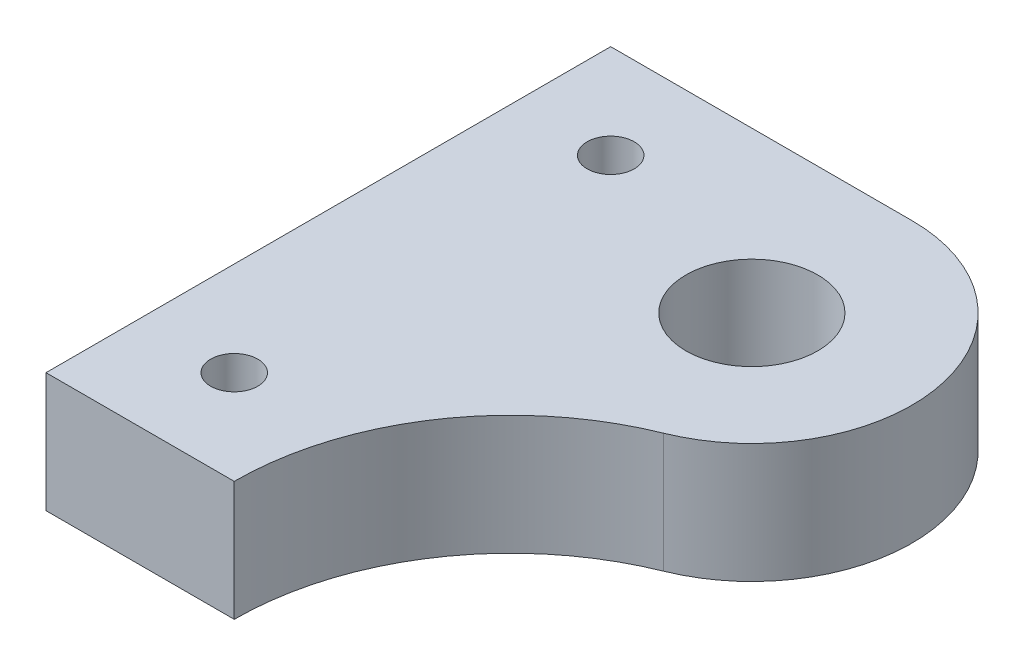
ISO-10303-21;
HEADER;
FILE_DESCRIPTION(('STEP AP214'),'2;1');
FILE_NAME('part.step','',(''),(''),'','','');
FILE_SCHEMA(('AUTOMOTIVE_DESIGN { 1 0 10303 214 1 1 1 1 }'));
ENDSEC;
DATA;
#1=APPLICATION_CONTEXT('core data for automotive mechanical design processes');
#2=APPLICATION_PROTOCOL_DEFINITION('international standard','automotive_design',2000,#1);
#3=PRODUCT_CONTEXT('',#1,'mechanical');
#4=PRODUCT('Part','Part','',(#3));
#5=PRODUCT_RELATED_PRODUCT_CATEGORY('part','',(#4));
#6=PRODUCT_DEFINITION_FORMATION('','',#4);
#7=PRODUCT_DEFINITION_CONTEXT('part definition',#1,'design');
#8=PRODUCT_DEFINITION('design','',#6,#7);
#9=PRODUCT_DEFINITION_SHAPE('','',#8);
#10=(LENGTH_UNIT() NAMED_UNIT(*) SI_UNIT(.MILLI.,.METRE.));
#11=(NAMED_UNIT(*) PLANE_ANGLE_UNIT() SI_UNIT($,.RADIAN.));
#12=(NAMED_UNIT(*) SI_UNIT($,.STERADIAN.) SOLID_ANGLE_UNIT());
#13=UNCERTAINTY_MEASURE_WITH_UNIT(LENGTH_MEASURE(1.E-05),#10,'distance_accuracy_value','');
#14=(GEOMETRIC_REPRESENTATION_CONTEXT(3) GLOBAL_UNCERTAINTY_ASSIGNED_CONTEXT((#13)) GLOBAL_UNIT_ASSIGNED_CONTEXT((#10,
#11,#12)) REPRESENTATION_CONTEXT('',''));
#15=CARTESIAN_POINT('',(0.,0.,0.));
#16=DIRECTION('',(0.,0.,1.));
#17=DIRECTION('',(1.,0.,0.));
#18=AXIS2_PLACEMENT_3D('',#15,#16,#17);
#19=CARTESIAN_POINT('',(49.3793103448276,6.35,0.));
#20=DIRECTION('',(0.,-1.,0.));
#21=DIRECTION('',(0.,0.,-1.));
#22=AXIS2_PLACEMENT_3D('',#19,#20,#21);
#23=PLANE('',#22);
#24=CARTESIAN_POINT('',(49.3793103448276,6.35,0.));
#25=DIRECTION('',(0.,-1.,0.));
#26=DIRECTION('',(0.,0.,-1.));
#27=AXIS2_PLACEMENT_3D('',#24,#25,#26);
#28=CIRCLE('',#27,29.3793103448276);
#29=CARTESIAN_POINT('',(20.,6.35,0.));
#30=VERTEX_POINT('',#29);
#31=CARTESIAN_POINT('',(38.3702602230483,6.35,-27.2386617100372));
#32=VERTEX_POINT('',#31);
#33=EDGE_CURVE('E117',#30,#32,#28,.T.);
#34=ORIENTED_EDGE('',*,*,#33,.T.);
#35=CARTESIAN_POINT('',(32.,6.35,-43.));
#36=DIRECTION('',(0.,1.,0.));
#37=DIRECTION('',(0.,0.,1.));
#38=AXIS2_PLACEMENT_3D('',#35,#36,#37);
#39=CIRCLE('',#38,17.);
#40=CARTESIAN_POINT('',(32.,6.35,-60.));
#41=VERTEX_POINT('',#40);
#42=EDGE_CURVE('E84',#32,#41,#39,.T.);
#43=ORIENTED_EDGE('',*,*,#42,.T.);
#44=DIRECTION('',(-1.,0.,0.));
#45=VECTOR('',#44,1.);
#46=CARTESIAN_POINT('',(32.,6.35,-60.));
#47=LINE('',#46,#45);
#48=CARTESIAN_POINT('',(0.,6.35,-60.));
#49=VERTEX_POINT('',#48);
#50=EDGE_CURVE('E88',#41,#49,#47,.T.);
#51=ORIENTED_EDGE('',*,*,#50,.T.);
#52=DIRECTION('',(0.,0.,1.));
#53=VECTOR('',#52,1.);
#54=CARTESIAN_POINT('',(0.,6.35,0.));
#55=LINE('',#54,#53);
#56=CARTESIAN_POINT('',(0.,6.35,0.));
#57=VERTEX_POINT('',#56);
#58=EDGE_CURVE('E92',#49,#57,#55,.T.);
#59=ORIENTED_EDGE('',*,*,#58,.T.);
#60=DIRECTION('',(1.,0.,0.));
#61=VECTOR('',#60,1.);
#62=CARTESIAN_POINT('',(20.,6.35,0.));
#63=LINE('',#62,#61);
#64=EDGE_CURVE('E50',#57,#30,#63,.T.);
#65=ORIENTED_EDGE('',*,*,#64,.T.);
#66=EDGE_LOOP('',(#34,#43,#51,#59,#65));
#67=FACE_BOUND('',#66,.T.);
#68=CARTESIAN_POINT('',(32.,6.35,-43.));
#69=DIRECTION('',(0.,1.,0.));
#70=DIRECTION('',(0.,0.,1.));
#71=AXIS2_PLACEMENT_3D('',#68,#69,#70);
#72=CIRCLE('',#71,7.00000000000002);
#73=CARTESIAN_POINT('',(32.,6.35,-36.));
#74=VERTEX_POINT('',#73);
#75=EDGE_CURVE('E112',#74,#74,#72,.T.);
#76=ORIENTED_EDGE('',*,*,#75,.F.);
#77=EDGE_LOOP('',(#76));
#78=FACE_BOUND('',#77,.T.);
#79=CARTESIAN_POINT('',(10.,6.35,-10.));
#80=DIRECTION('',(0.,1.,0.));
#81=DIRECTION('',(0.,0.,1.));
#82=AXIS2_PLACEMENT_3D('',#79,#80,#81);
#83=CIRCLE('',#82,2.5);
#84=CARTESIAN_POINT('',(10.,6.35,-7.5));
#85=VERTEX_POINT('',#84);
#86=EDGE_CURVE('E166',#85,#85,#83,.T.);
#87=ORIENTED_EDGE('',*,*,#86,.F.);
#88=EDGE_LOOP('',(#87));
#89=FACE_BOUND('',#88,.T.);
#90=CARTESIAN_POINT('',(10.,6.35,-50.));
#91=DIRECTION('',(0.,1.,0.));
#92=DIRECTION('',(0.,0.,1.));
#93=AXIS2_PLACEMENT_3D('',#90,#91,#92);
#94=CIRCLE('',#93,2.5);
#95=CARTESIAN_POINT('',(10.,6.35,-47.5));
#96=VERTEX_POINT('',#95);
#97=EDGE_CURVE('E157',#96,#96,#94,.T.);
#98=ORIENTED_EDGE('',*,*,#97,.F.);
#99=EDGE_LOOP('',(#98));
#100=FACE_BOUND('',#99,.T.);
#101=ADVANCED_FACE('F33',(#67,#78,#89,#100),#23,.F.);
#102=CARTESIAN_POINT('',(49.3793103448276,-6.35,0.));
#103=DIRECTION('',(0.,-1.,0.));
#104=DIRECTION('',(0.,0.,-1.));
#105=AXIS2_PLACEMENT_3D('',#102,#103,#104);
#106=PLANE('',#105);
#107=CARTESIAN_POINT('',(10.,-6.35,-10.));
#108=DIRECTION('',(0.,1.,0.));
#109=DIRECTION('',(0.,0.,1.));
#110=AXIS2_PLACEMENT_3D('',#107,#108,#109);
#111=CIRCLE('',#110,2.5);
#112=CARTESIAN_POINT('',(10.,-6.35,-7.5));
#113=VERTEX_POINT('',#112);
#114=EDGE_CURVE('E163',#113,#113,#111,.T.);
#115=ORIENTED_EDGE('',*,*,#114,.T.);
#116=EDGE_LOOP('',(#115));
#117=FACE_BOUND('',#116,.T.);
#118=CARTESIAN_POINT('',(49.3793103448276,-6.35,0.));
#119=DIRECTION('',(0.,-1.,0.));
#120=DIRECTION('',(0.,0.,-1.));
#121=AXIS2_PLACEMENT_3D('',#118,#119,#120);
#122=CIRCLE('',#121,29.3793103448276);
#123=CARTESIAN_POINT('',(20.,-6.35,0.));
#124=VERTEX_POINT('',#123);
#125=CARTESIAN_POINT('',(38.3702602230483,-6.35,-27.2386617100372));
#126=VERTEX_POINT('',#125);
#127=EDGE_CURVE('E108',#124,#126,#122,.T.);
#128=ORIENTED_EDGE('',*,*,#127,.F.);
#129=DIRECTION('',(1.,0.,0.));
#130=VECTOR('',#129,1.);
#131=CARTESIAN_POINT('',(20.,-6.35,0.));
#132=LINE('',#131,#130);
#133=CARTESIAN_POINT('',(0.,-6.35,0.));
#134=VERTEX_POINT('',#133);
#135=EDGE_CURVE('E76',#134,#124,#132,.T.);
#136=ORIENTED_EDGE('',*,*,#135,.F.);
#137=DIRECTION('',(0.,0.,1.));
#138=VECTOR('',#137,1.);
#139=CARTESIAN_POINT('',(0.,-6.35,0.));
#140=LINE('',#139,#138);
#141=CARTESIAN_POINT('',(0.,-6.35,-60.));
#142=VERTEX_POINT('',#141);
#143=EDGE_CURVE('E70',#142,#134,#140,.T.);
#144=ORIENTED_EDGE('',*,*,#143,.F.);
#145=DIRECTION('',(-1.,0.,0.));
#146=VECTOR('',#145,1.);
#147=CARTESIAN_POINT('',(32.,-6.35,-60.));
#148=LINE('',#147,#146);
#149=CARTESIAN_POINT('',(32.,-6.35,-60.));
#150=VERTEX_POINT('',#149);
#151=EDGE_CURVE('E99',#150,#142,#148,.T.);
#152=ORIENTED_EDGE('',*,*,#151,.F.);
#153=CARTESIAN_POINT('',(32.,-6.35,-43.));
#154=DIRECTION('',(0.,1.,0.));
#155=DIRECTION('',(0.,0.,1.));
#156=AXIS2_PLACEMENT_3D('',#153,#154,#155);
#157=CIRCLE('',#156,17.);
#158=EDGE_CURVE('E111',#126,#150,#157,.T.);
#159=ORIENTED_EDGE('',*,*,#158,.F.);
#160=EDGE_LOOP('',(#128,#136,#144,#152,#159));
#161=FACE_BOUND('',#160,.T.);
#162=CARTESIAN_POINT('',(32.,-6.35,-43.));
#163=DIRECTION('',(0.,1.,0.));
#164=DIRECTION('',(0.,0.,1.));
#165=AXIS2_PLACEMENT_3D('',#162,#163,#164);
#166=CIRCLE('',#165,7.00000000000002);
#167=CARTESIAN_POINT('',(32.,-6.35,-36.));
#168=VERTEX_POINT('',#167);
#169=EDGE_CURVE('E169',#168,#168,#166,.T.);
#170=ORIENTED_EDGE('',*,*,#169,.T.);
#171=EDGE_LOOP('',(#170));
#172=FACE_BOUND('',#171,.T.);
#173=CARTESIAN_POINT('',(10.,-6.35,-50.));
#174=DIRECTION('',(0.,1.,0.));
#175=DIRECTION('',(0.,0.,1.));
#176=AXIS2_PLACEMENT_3D('',#173,#174,#175);
#177=CIRCLE('',#176,2.5);
#178=CARTESIAN_POINT('',(10.,-6.35,-47.5));
#179=VERTEX_POINT('',#178);
#180=EDGE_CURVE('E160',#179,#179,#177,.T.);
#181=ORIENTED_EDGE('',*,*,#180,.T.);
#182=EDGE_LOOP('',(#181));
#183=FACE_BOUND('',#182,.T.);
#184=ADVANCED_FACE('F121',(#117,#161,#172,#183),#106,.T.);
#185=CARTESIAN_POINT('',(49.3793103448276,6.35,0.));
#186=DIRECTION('',(0.,-1.,0.));
#187=DIRECTION('',(0.,0.,-1.));
#188=AXIS2_PLACEMENT_3D('',#185,#186,#187);
#189=CYLINDRICAL_SURFACE('',#188,29.3793103448276);
#190=ORIENTED_EDGE('',*,*,#127,.T.);
#191=DIRECTION('',(0.,-1.,0.));
#192=VECTOR('',#191,1.);
#193=CARTESIAN_POINT('',(38.3702602230483,6.35,-27.2386617100372));
#194=LINE('',#193,#192);
#195=EDGE_CURVE('E11',#32,#126,#194,.T.);
#196=ORIENTED_EDGE('',*,*,#195,.F.);
#197=ORIENTED_EDGE('',*,*,#33,.F.);
#198=DIRECTION('',(0.,-1.,0.));
#199=VECTOR('',#198,1.);
#200=CARTESIAN_POINT('',(20.,6.35,0.));
#201=LINE('',#200,#199);
#202=EDGE_CURVE('E104',#30,#124,#201,.T.);
#203=ORIENTED_EDGE('',*,*,#202,.T.);
#204=EDGE_LOOP('',(#190,#196,#197,#203));
#205=FACE_BOUND('',#204,.T.);
#206=ADVANCED_FACE('F35',(#205),#189,.F.);
#207=CARTESIAN_POINT('',(32.,6.35,-43.));
#208=DIRECTION('',(0.,-1.,0.));
#209=DIRECTION('',(0.,0.,-1.));
#210=AXIS2_PLACEMENT_3D('',#207,#208,#209);
#211=CYLINDRICAL_SURFACE('',#210,17.);
#212=ORIENTED_EDGE('',*,*,#158,.T.);
#213=DIRECTION('',(0.,-1.,0.));
#214=VECTOR('',#213,1.);
#215=CARTESIAN_POINT('',(32.,6.35,-60.));
#216=LINE('',#215,#214);
#217=EDGE_CURVE('E42',#41,#150,#216,.T.);
#218=ORIENTED_EDGE('',*,*,#217,.F.);
#219=ORIENTED_EDGE('',*,*,#42,.F.);
#220=ORIENTED_EDGE('',*,*,#195,.T.);
#221=EDGE_LOOP('',(#212,#218,#219,#220));
#222=FACE_BOUND('',#221,.T.);
#223=ADVANCED_FACE('F211',(#222),#211,.T.);
#224=CARTESIAN_POINT('',(32.,6.35,-60.));
#225=DIRECTION('',(0.,0.,1.));
#226=DIRECTION('',(1.,0.,0.));
#227=AXIS2_PLACEMENT_3D('',#224,#225,#226);
#228=PLANE('',#227);
#229=ORIENTED_EDGE('',*,*,#151,.T.);
#230=DIRECTION('',(0.,-1.,0.));
#231=VECTOR('',#230,1.);
#232=CARTESIAN_POINT('',(0.,6.35,-60.));
#233=LINE('',#232,#231);
#234=EDGE_CURVE('E96',#49,#142,#233,.T.);
#235=ORIENTED_EDGE('',*,*,#234,.F.);
#236=ORIENTED_EDGE('',*,*,#50,.F.);
#237=ORIENTED_EDGE('',*,*,#217,.T.);
#238=EDGE_LOOP('',(#229,#235,#236,#237));
#239=FACE_BOUND('',#238,.T.);
#240=ADVANCED_FACE('F97',(#239),#228,.F.);
#241=CARTESIAN_POINT('',(0.,6.35,0.));
#242=DIRECTION('',(1.,0.,0.));
#243=DIRECTION('',(0.,0.,-1.));
#244=AXIS2_PLACEMENT_3D('',#241,#242,#243);
#245=PLANE('',#244);
#246=ORIENTED_EDGE('',*,*,#143,.T.);
#247=DIRECTION('',(0.,-1.,0.));
#248=VECTOR('',#247,1.);
#249=CARTESIAN_POINT('',(0.,6.35,0.));
#250=LINE('',#249,#248);
#251=EDGE_CURVE('E100',#57,#134,#250,.T.);
#252=ORIENTED_EDGE('',*,*,#251,.F.);
#253=ORIENTED_EDGE('',*,*,#58,.F.);
#254=ORIENTED_EDGE('',*,*,#234,.T.);
#255=EDGE_LOOP('',(#246,#252,#253,#254));
#256=FACE_BOUND('',#255,.T.);
#257=ADVANCED_FACE('F102',(#256),#245,.F.);
#258=CARTESIAN_POINT('',(20.,6.35,0.));
#259=DIRECTION('',(0.,0.,-1.));
#260=DIRECTION('',(-1.,0.,0.));
#261=AXIS2_PLACEMENT_3D('',#258,#259,#260);
#262=PLANE('',#261);
#263=ORIENTED_EDGE('',*,*,#135,.T.);
#264=ORIENTED_EDGE('',*,*,#202,.F.);
#265=ORIENTED_EDGE('',*,*,#64,.F.);
#266=ORIENTED_EDGE('',*,*,#251,.T.);
#267=EDGE_LOOP('',(#263,#264,#265,#266));
#268=FACE_BOUND('',#267,.T.);
#269=ADVANCED_FACE('F126',(#268),#262,.F.);
#270=CARTESIAN_POINT('',(32.,6.35,-43.));
#271=DIRECTION('',(0.,-1.,0.));
#272=DIRECTION('',(0.,0.,-1.));
#273=AXIS2_PLACEMENT_3D('',#270,#271,#272);
#274=CYLINDRICAL_SURFACE('',#273,7.00000000000002);
#275=ORIENTED_EDGE('',*,*,#75,.T.);
#276=EDGE_LOOP('',(#275));
#277=FACE_BOUND('',#276,.T.);
#278=ORIENTED_EDGE('',*,*,#169,.F.);
#279=EDGE_LOOP('',(#278));
#280=FACE_BOUND('',#279,.T.);
#281=ADVANCED_FACE('F128',(#277,#280),#274,.F.);
#282=CARTESIAN_POINT('',(10.,6.35,-10.));
#283=DIRECTION('',(0.,-1.,0.));
#284=DIRECTION('',(0.,0.,-1.));
#285=AXIS2_PLACEMENT_3D('',#282,#283,#284);
#286=CYLINDRICAL_SURFACE('',#285,2.5);
#287=ORIENTED_EDGE('',*,*,#86,.T.);
#288=EDGE_LOOP('',(#287));
#289=FACE_BOUND('',#288,.T.);
#290=ORIENTED_EDGE('',*,*,#114,.F.);
#291=EDGE_LOOP('',(#290));
#292=FACE_BOUND('',#291,.T.);
#293=ADVANCED_FACE('F134',(#289,#292),#286,.F.);
#294=CARTESIAN_POINT('',(10.,6.35,-50.));
#295=DIRECTION('',(0.,-1.,0.));
#296=DIRECTION('',(0.,0.,-1.));
#297=AXIS2_PLACEMENT_3D('',#294,#295,#296);
#298=CYLINDRICAL_SURFACE('',#297,2.5);
#299=ORIENTED_EDGE('',*,*,#97,.T.);
#300=EDGE_LOOP('',(#299));
#301=FACE_BOUND('',#300,.T.);
#302=ORIENTED_EDGE('',*,*,#180,.F.);
#303=EDGE_LOOP('',(#302));
#304=FACE_BOUND('',#303,.T.);
#305=ADVANCED_FACE('F148',(#301,#304),#298,.F.);
#306=CLOSED_SHELL('',(#101,#184,#206,#223,#240,#257,#269,#281,#293,#305));
#307=MANIFOLD_SOLID_BREP('B2',#306);
#308=ADVANCED_BREP_SHAPE_REPRESENTATION('',(#18,#307),#14);
#309=SHAPE_DEFINITION_REPRESENTATION(#9,#308);
ENDSEC;
END-ISO-10303-21;
